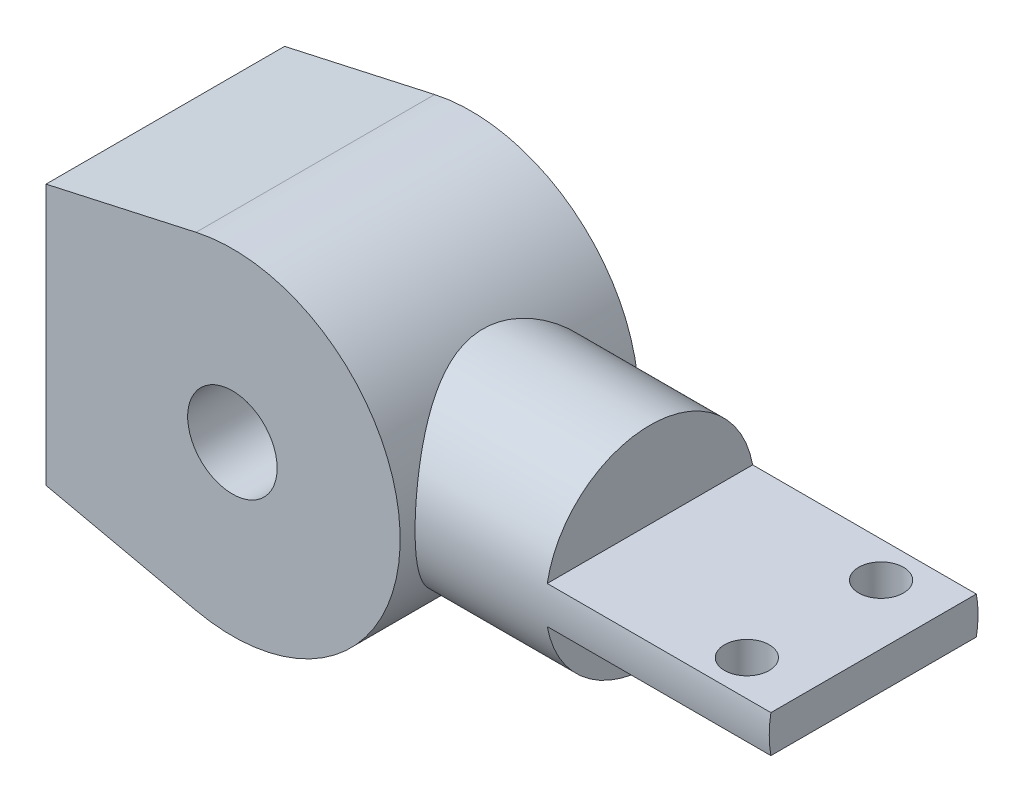
ISO-10303-21;
HEADER;
FILE_DESCRIPTION(('STEP AP214'),'2;1');
FILE_NAME('part.step','',(''),(''),'','','');
FILE_SCHEMA(('AUTOMOTIVE_DESIGN { 1 0 10303 214 1 1 1 1 }'));
ENDSEC;
DATA;
#1=APPLICATION_CONTEXT('core data for automotive mechanical design processes');
#2=APPLICATION_PROTOCOL_DEFINITION('international standard','automotive_design',2000,#1);
#3=PRODUCT_CONTEXT('',#1,'mechanical');
#4=PRODUCT('Part','Part','',(#3));
#5=PRODUCT_RELATED_PRODUCT_CATEGORY('part','',(#4));
#6=PRODUCT_DEFINITION_FORMATION('','',#4);
#7=PRODUCT_DEFINITION_CONTEXT('part definition',#1,'design');
#8=PRODUCT_DEFINITION('design','',#6,#7);
#9=PRODUCT_DEFINITION_SHAPE('','',#8);
#10=(LENGTH_UNIT() NAMED_UNIT(*) SI_UNIT(.MILLI.,.METRE.));
#11=(NAMED_UNIT(*) PLANE_ANGLE_UNIT() SI_UNIT($,.RADIAN.));
#12=(NAMED_UNIT(*) SI_UNIT($,.STERADIAN.) SOLID_ANGLE_UNIT());
#13=UNCERTAINTY_MEASURE_WITH_UNIT(LENGTH_MEASURE(1.E-05),#10,'distance_accuracy_value','');
#14=(GEOMETRIC_REPRESENTATION_CONTEXT(3) GLOBAL_UNCERTAINTY_ASSIGNED_CONTEXT((#13)) GLOBAL_UNIT_ASSIGNED_CONTEXT((#10,
#11,#12)) REPRESENTATION_CONTEXT('',''));
#15=CARTESIAN_POINT('',(0.,0.,0.));
#16=DIRECTION('',(0.,0.,1.));
#17=DIRECTION('',(1.,0.,0.));
#18=AXIS2_PLACEMENT_3D('',#15,#16,#17);
#19=CARTESIAN_POINT('',(40.,0.,0.));
#20=DIRECTION('',(1.,0.,0.));
#21=DIRECTION('',(0.,0.,-1.));
#22=AXIS2_PLACEMENT_3D('',#19,#20,#21);
#23=PLANE('',#22);
#24=CARTESIAN_POINT('',(40.,0.,0.));
#25=DIRECTION('',(1.,0.,0.));
#26=DIRECTION('',(0.,0.,-1.));
#27=AXIS2_PLACEMENT_3D('',#24,#25,#26);
#28=CIRCLE('',#27,14.);
#29=CARTESIAN_POINT('',(40.,2.5,-13.7749773139559));
#30=VERTEX_POINT('',#29);
#31=CARTESIAN_POINT('',(40.,2.5,13.7749773139559));
#32=VERTEX_POINT('',#31);
#33=EDGE_CURVE('E61',#30,#32,#28,.T.);
#34=ORIENTED_EDGE('',*,*,#33,.T.);
#35=DIRECTION('',(0.,0.,-1.));
#36=VECTOR('',#35,1.);
#37=CARTESIAN_POINT('',(40.,2.5,0.));
#38=LINE('',#37,#36);
#39=EDGE_CURVE('E111',#32,#30,#38,.T.);
#40=ORIENTED_EDGE('',*,*,#39,.T.);
#41=EDGE_LOOP('',(#34,#40));
#42=FACE_BOUND('',#41,.T.);
#43=ADVANCED_FACE('F38',(#42),#23,.T.);
#44=CARTESIAN_POINT('',(0.,0.,16.));
#45=DIRECTION('',(0.,0.,1.));
#46=DIRECTION('',(1.,0.,0.));
#47=AXIS2_PLACEMENT_3D('',#44,#45,#46);
#48=PLANE('',#47);
#49=DIRECTION('',(-0.976255788673511,-0.216620947928542,0.));
#50=VECTOR('',#49,1.);
#51=CARTESIAN_POINT('',(-4.87397132839219,21.965755245154,16.));
#52=LINE('',#51,#50);
#53=CARTESIAN_POINT('',(-4.87397132839219,21.965755245154,16.));
#54=VERTEX_POINT('',#53);
#55=CARTESIAN_POINT('',(-25.,17.5,16.));
#56=VERTEX_POINT('',#55);
#57=EDGE_CURVE('E201',#54,#56,#52,.T.);
#58=ORIENTED_EDGE('',*,*,#57,.T.);
#59=DIRECTION('',(0.,-1.,0.));
#60=VECTOR('',#59,1.);
#61=CARTESIAN_POINT('',(-25.,17.5,16.));
#62=LINE('',#61,#60);
#63=CARTESIAN_POINT('',(-25.,-17.5,16.));
#64=VERTEX_POINT('',#63);
#65=EDGE_CURVE('E213',#56,#64,#62,.T.);
#66=ORIENTED_EDGE('',*,*,#65,.T.);
#67=DIRECTION('',(0.976255788673511,-0.216620947928542,0.));
#68=VECTOR('',#67,1.);
#69=CARTESIAN_POINT('',(-4.87397132839219,-21.965755245154,16.));
#70=LINE('',#69,#68);
#71=CARTESIAN_POINT('',(-4.87397132839219,-21.965755245154,16.));
#72=VERTEX_POINT('',#71);
#73=EDGE_CURVE('E211',#64,#72,#70,.T.);
#74=ORIENTED_EDGE('',*,*,#73,.T.);
#75=CARTESIAN_POINT('',(0.,0.,16.));
#76=DIRECTION('',(0.,0.,1.));
#77=DIRECTION('',(1.,0.,0.));
#78=AXIS2_PLACEMENT_3D('',#75,#76,#77);
#79=CIRCLE('',#78,22.5);
#80=EDGE_CURVE('E198',#72,#54,#79,.T.);
#81=ORIENTED_EDGE('',*,*,#80,.T.);
#82=EDGE_LOOP('',(#58,#66,#74,#81));
#83=FACE_BOUND('',#82,.T.);
#84=CARTESIAN_POINT('',(0.,0.,16.));
#85=DIRECTION('',(0.,0.,1.));
#86=DIRECTION('',(1.,0.,0.));
#87=AXIS2_PLACEMENT_3D('',#84,#85,#86);
#88=CIRCLE('',#87,6.);
#89=CARTESIAN_POINT('',(6.,0.,16.));
#90=VERTEX_POINT('',#89);
#91=EDGE_CURVE('E209',#90,#90,#88,.T.);
#92=ORIENTED_EDGE('',*,*,#91,.F.);
#93=EDGE_LOOP('',(#92));
#94=FACE_BOUND('',#93,.T.);
#95=ADVANCED_FACE('F168',(#83,#94),#48,.T.);
#96=CARTESIAN_POINT('',(0.,0.,-16.));
#97=DIRECTION('',(0.,0.,1.));
#98=DIRECTION('',(1.,0.,0.));
#99=AXIS2_PLACEMENT_3D('',#96,#97,#98);
#100=PLANE('',#99);
#101=DIRECTION('',(-0.976255788673511,-0.216620947928542,0.));
#102=VECTOR('',#101,1.);
#103=CARTESIAN_POINT('',(-4.87397132839219,21.965755245154,-16.));
#104=LINE('',#103,#102);
#105=CARTESIAN_POINT('',(-4.87397132839219,21.965755245154,-16.));
#106=VERTEX_POINT('',#105);
#107=CARTESIAN_POINT('',(-25.,17.5,-16.));
#108=VERTEX_POINT('',#107);
#109=EDGE_CURVE('E206',#106,#108,#104,.T.);
#110=ORIENTED_EDGE('',*,*,#109,.F.);
#111=CARTESIAN_POINT('',(0.,0.,-16.));
#112=DIRECTION('',(0.,0.,1.));
#113=DIRECTION('',(1.,0.,0.));
#114=AXIS2_PLACEMENT_3D('',#111,#112,#113);
#115=CIRCLE('',#114,22.5);
#116=CARTESIAN_POINT('',(-4.87397132839219,-21.965755245154,-16.));
#117=VERTEX_POINT('',#116);
#118=EDGE_CURVE('E199',#117,#106,#115,.T.);
#119=ORIENTED_EDGE('',*,*,#118,.F.);
#120=DIRECTION('',(0.976255788673511,-0.216620947928542,0.));
#121=VECTOR('',#120,1.);
#122=CARTESIAN_POINT('',(-4.87397132839219,-21.965755245154,-16.));
#123=LINE('',#122,#121);
#124=CARTESIAN_POINT('',(-25.,-17.5,-16.));
#125=VERTEX_POINT('',#124);
#126=EDGE_CURVE('E202',#125,#117,#123,.T.);
#127=ORIENTED_EDGE('',*,*,#126,.F.);
#128=DIRECTION('',(0.,-1.,0.));
#129=VECTOR('',#128,1.);
#130=CARTESIAN_POINT('',(-25.,17.5,-16.));
#131=LINE('',#130,#129);
#132=EDGE_CURVE('E204',#108,#125,#131,.T.);
#133=ORIENTED_EDGE('',*,*,#132,.F.);
#134=EDGE_LOOP('',(#110,#119,#127,#133));
#135=FACE_BOUND('',#134,.T.);
#136=CARTESIAN_POINT('',(0.,0.,-16.));
#137=DIRECTION('',(0.,0.,1.));
#138=DIRECTION('',(1.,0.,0.));
#139=AXIS2_PLACEMENT_3D('',#136,#137,#138);
#140=CIRCLE('',#139,6.);
#141=CARTESIAN_POINT('',(6.,0.,-16.));
#142=VERTEX_POINT('',#141);
#143=EDGE_CURVE('E217',#142,#142,#140,.T.);
#144=ORIENTED_EDGE('',*,*,#143,.T.);
#145=EDGE_LOOP('',(#144));
#146=FACE_BOUND('',#145,.T.);
#147=ADVANCED_FACE('F224',(#135,#146),#100,.F.);
#148=CARTESIAN_POINT('',(-4.87397132839219,21.965755245154,16.));
#149=DIRECTION('',(0.216620947928542,-0.976255788673511,0.));
#150=DIRECTION('',(0.976255788673512,0.216620947928542,0.));
#151=AXIS2_PLACEMENT_3D('',#148,#149,#150);
#152=PLANE('',#151);
#153=ORIENTED_EDGE('',*,*,#109,.T.);
#154=DIRECTION('',(0.,0.,-1.));
#155=VECTOR('',#154,1.);
#156=CARTESIAN_POINT('',(-25.,17.5,16.));
#157=LINE('',#156,#155);
#158=EDGE_CURVE('E11',#56,#108,#157,.T.);
#159=ORIENTED_EDGE('',*,*,#158,.F.);
#160=ORIENTED_EDGE('',*,*,#57,.F.);
#161=DIRECTION('',(0.,0.,-1.));
#162=VECTOR('',#161,1.);
#163=CARTESIAN_POINT('',(-4.87397132839219,21.965755245154,16.));
#164=LINE('',#163,#162);
#165=EDGE_CURVE('E195',#54,#106,#164,.T.);
#166=ORIENTED_EDGE('',*,*,#165,.T.);
#167=EDGE_LOOP('',(#153,#159,#160,#166));
#168=FACE_BOUND('',#167,.T.);
#169=ADVANCED_FACE('F40',(#168),#152,.F.);
#170=CARTESIAN_POINT('',(-25.,17.5,16.));
#171=DIRECTION('',(1.,0.,0.));
#172=DIRECTION('',(0.,0.,-1.));
#173=AXIS2_PLACEMENT_3D('',#170,#171,#172);
#174=PLANE('',#173);
#175=ORIENTED_EDGE('',*,*,#132,.T.);
#176=DIRECTION('',(0.,0.,-1.));
#177=VECTOR('',#176,1.);
#178=CARTESIAN_POINT('',(-25.,-17.5,16.));
#179=LINE('',#178,#177);
#180=EDGE_CURVE('E47',#64,#125,#179,.T.);
#181=ORIENTED_EDGE('',*,*,#180,.F.);
#182=ORIENTED_EDGE('',*,*,#65,.F.);
#183=ORIENTED_EDGE('',*,*,#158,.T.);
#184=EDGE_LOOP('',(#175,#181,#182,#183));
#185=FACE_BOUND('',#184,.T.);
#186=ADVANCED_FACE('F238',(#185),#174,.F.);
#187=CARTESIAN_POINT('',(-4.87397132839219,-21.965755245154,16.));
#188=DIRECTION('',(0.216620947928542,0.976255788673511,0.));
#189=DIRECTION('',(-0.976255788673512,0.216620947928542,0.));
#190=AXIS2_PLACEMENT_3D('',#187,#188,#189);
#191=PLANE('',#190);
#192=ORIENTED_EDGE('',*,*,#126,.T.);
#193=DIRECTION('',(0.,0.,-1.));
#194=VECTOR('',#193,1.);
#195=CARTESIAN_POINT('',(-4.87397132839219,-21.965755245154,16.));
#196=LINE('',#195,#194);
#197=EDGE_CURVE('E192',#72,#117,#196,.T.);
#198=ORIENTED_EDGE('',*,*,#197,.F.);
#199=ORIENTED_EDGE('',*,*,#73,.F.);
#200=ORIENTED_EDGE('',*,*,#180,.T.);
#201=EDGE_LOOP('',(#192,#198,#199,#200));
#202=FACE_BOUND('',#201,.T.);
#203=ADVANCED_FACE('F235',(#202),#191,.F.);
#204=CARTESIAN_POINT('',(0.,0.,16.));
#205=DIRECTION('',(0.,0.,-1.));
#206=DIRECTION('',(-1.,0.,0.));
#207=AXIS2_PLACEMENT_3D('',#204,#205,#206);
#208=CYLINDRICAL_SURFACE('',#207,22.5);
#209=CARTESIAN_POINT('',(22.5,0.,-14.));
#210=CARTESIAN_POINT('',(22.4999990143699,0.356097070760692,-13.9999991063449));
#211=CARTESIAN_POINT('',(22.4915272958149,0.712218350277574,-13.9863954765435));
#212=CARTESIAN_POINT('',(22.4578466611244,1.42174063001493,-13.9321685824194));
#213=CARTESIAN_POINT('',(22.4326301887648,1.77514032923202,-13.8915331197188));
#214=CARTESIAN_POINT('',(22.3660283513862,2.47694073666972,-13.7837231030717));
#215=CARTESIAN_POINT('',(22.3246150990087,2.82533174256533,-13.7165027734724));
#216=CARTESIAN_POINT('',(22.2266321618331,3.51394010054276,-13.5564441244614));
#217=CARTESIAN_POINT('',(22.1700640019058,3.85415827121584,-13.4636083824175));
#218=CARTESIAN_POINT('',(22.0433958764243,4.52259338441289,-13.2539894629711));
#219=CARTESIAN_POINT('',(21.9733648543906,4.85086174847135,-13.1373281147551));
#220=CARTESIAN_POINT('',(21.8211053520407,5.49536361825577,-12.8810427155204));
#221=CARTESIAN_POINT('',(21.7388766091287,5.81159686470234,-12.7414181701369));
#222=CARTESIAN_POINT('',(21.5639238631528,6.43044019166893,-12.4405700102356));
#223=CARTESIAN_POINT('',(21.4712031207009,6.73305446393551,-12.2793531031596));
#224=CARTESIAN_POINT('',(21.2770168328875,7.32360555209682,-11.9365571460911));
#225=CARTESIAN_POINT('',(21.1755502028841,7.61154054043849,-11.7549755696832));
#226=CARTESIAN_POINT('',(20.9573974599138,8.19400545558421,-11.3574765199916));
#227=CARTESIAN_POINT('',(20.8401426208988,8.48724295592486,-11.1399774171205));
#228=CARTESIAN_POINT('',(20.600024873324,9.05449350465571,-10.6840341744649));
#229=CARTESIAN_POINT('',(20.4771617165154,9.32850570068461,-10.445589107087));
#230=CARTESIAN_POINT('',(20.2281690739126,9.85680235955471,-9.94862465188904));
#231=CARTESIAN_POINT('',(20.1020356451637,10.111061375416,-9.69008020116803));
#232=CARTESIAN_POINT('',(19.8492724340888,10.5986702200811,-9.1542032090265));
#233=CARTESIAN_POINT('',(19.722642637357,10.8320194372713,-8.87687011845291));
#234=CARTESIAN_POINT('',(19.4547996495074,11.3068419436011,-8.2658596247561));
#235=CARTESIAN_POINT('',(19.3139089577244,11.545205662179,-7.92961458355073));
#236=CARTESIAN_POINT('',(19.0393482416016,11.9925865501106,-7.23522428056693));
#237=CARTESIAN_POINT('',(18.9056795541224,12.2015982975125,-6.877074990088));
#238=CARTESIAN_POINT('',(18.6504569420656,12.5882506642244,-6.14073545483857));
#239=CARTESIAN_POINT('',(18.528886831374,12.7659334496767,-5.76257305179082));
#240=CARTESIAN_POINT('',(18.3026958276451,13.0881671689531,-4.98756561364782));
#241=CARTESIAN_POINT('',(18.1980680018518,13.2327316648236,-4.59072830652404));
#242=CARTESIAN_POINT('',(18.0349292211783,13.4538110619401,-3.88513918827319));
#243=CARTESIAN_POINT('',(17.9714792470539,13.5382643592609,-3.57999709901742));
#244=CARTESIAN_POINT('',(17.8586883245612,13.6867074831745,-2.96224320580907));
#245=CARTESIAN_POINT('',(17.8093439846518,13.7507022292345,-2.64963321704918));
#246=CARTESIAN_POINT('',(17.7265086605148,13.8573251676281,-2.01907360660311));
#247=CARTESIAN_POINT('',(17.6929994513684,13.8999779261594,-1.70113056156642));
#248=CARTESIAN_POINT('',(17.6430064881633,13.9633794501665,-1.06171502205683));
#249=CARTESIAN_POINT('',(17.6265229749471,13.9841279057882,-0.740242477721284));
#250=CARTESIAN_POINT('',(17.6112162512838,14.0034002854199,-0.0953808872242191));
#251=CARTESIAN_POINT('',(17.6124383808281,14.0018671514822,0.228010958708225));
#252=CARTESIAN_POINT('',(17.6326039054413,13.97646364726,0.873354428547934));
#253=CARTESIAN_POINT('',(17.6515473921147,13.9525931615104,1.19530604500179));
#254=CARTESIAN_POINT('',(17.7064243703099,13.8828847906998,1.83556301177622));
#255=CARTESIAN_POINT('',(17.7423695341295,13.8370318135284,2.15386570296615));
#256=CARTESIAN_POINT('',(17.8299101531281,13.7240443241488,2.78446216526763));
#257=CARTESIAN_POINT('',(17.8815059542076,13.6569093415775,3.09675580340859));
#258=CARTESIAN_POINT('',(17.9972888935506,13.5039464211317,3.70676991729286));
#259=CARTESIAN_POINT('',(18.0611741417939,13.4185620879421,4.00465984733719));
#260=CARTESIAN_POINT('',(18.2003635920619,13.2291560354186,4.59179982140109));
#261=CARTESIAN_POINT('',(18.2756715114669,13.1251282467728,4.88104701592401));
#262=CARTESIAN_POINT('',(18.4357306593898,12.8993400599701,5.44983142456797));
#263=CARTESIAN_POINT('',(18.5204822849188,12.7775789162412,5.7293682298181));
#264=CARTESIAN_POINT('',(18.6974771275311,12.517153681204,6.27798380238451));
#265=CARTESIAN_POINT('',(18.7897207095436,12.3784887663568,6.54706205932532));
#266=CARTESIAN_POINT('',(18.997481055651,12.0577227084505,7.12315036574905));
#267=CARTESIAN_POINT('',(19.114138485546,11.8723373870692,7.42792424344295));
#268=CARTESIAN_POINT('',(19.3523613239283,11.4799300062105,8.02107596986107));
#269=CARTESIAN_POINT('',(19.4739260475583,11.2729109595519,8.30945609304614));
#270=CARTESIAN_POINT('',(19.7193557781036,10.8378705685859,8.86940709190691));
#271=CARTESIAN_POINT('',(19.8432230246409,10.6098278185812,9.14096035407191));
#272=CARTESIAN_POINT('',(20.0905456910712,10.1337040929321,9.6661096951861));
#273=CARTESIAN_POINT('',(20.2140010842358,9.88562184213812,9.9197046294846));
#274=CARTESIAN_POINT('',(20.4778479284996,9.3283197696847,10.4476162402387));
#275=CARTESIAN_POINT('',(20.6177380925806,9.01571048102724,10.7186212696107));
#276=CARTESIAN_POINT('',(20.8899601598757,8.36562967979878,11.2333493529561));
#277=CARTESIAN_POINT('',(21.0222911743807,8.02815525453593,11.4770692023033));
#278=CARTESIAN_POINT('',(21.2758074096154,7.3299323932841,11.9350888320568));
#279=CARTESIAN_POINT('',(21.3969953836647,6.96918974429674,12.1493958865148));
#280=CARTESIAN_POINT('',(21.6248469618756,6.22630498724363,12.5463308451294));
#281=CARTESIAN_POINT('',(21.7315123020849,5.84416544470126,12.7289625365012));
#282=CARTESIAN_POINT('',(21.9217363589385,5.08260793859718,13.0509942907445));
#283=CARTESIAN_POINT('',(22.0062449689521,4.70420212464339,13.1922230753291));
#284=CARTESIAN_POINT('',(22.1570252528652,3.93324908027808,13.442236496525));
#285=CARTESIAN_POINT('',(22.2232972892521,3.54070213112461,13.5510217780177));
#286=CARTESIAN_POINT('',(22.3354988912287,2.74528889528994,13.7342547837559));
#287=CARTESIAN_POINT('',(22.3814519255366,2.34243508535216,13.8087421267131));
#288=CARTESIAN_POINT('',(22.4516271114232,1.52990582154782,13.9221968391314));
#289=CARTESIAN_POINT('',(22.4758528968536,1.12023152007733,13.961170148282));
#290=CARTESIAN_POINT('',(22.4998719272296,0.358889373676654,13.9997998195308));
#291=CARTESIAN_POINT('',(22.5027361711104,0.00755774378719221,14.0043982827077));
#292=CARTESIAN_POINT('',(22.4920251896601,-0.694179982355568,13.9871816996814));
#293=CARTESIAN_POINT('',(22.4784519037889,-1.04458618291156,13.9653697696335));
#294=CARTESIAN_POINT('',(22.4352021344506,-1.74175208722438,13.8956481416465));
#295=CARTESIAN_POINT('',(22.4055265956152,-2.08851200367258,13.8477399746312));
#296=CARTESIAN_POINT('',(22.3307880770863,-2.77586354777609,13.7264844114638));
#297=CARTESIAN_POINT('',(22.285724811575,-3.11645506073326,13.653136542784));
#298=CARTESIAN_POINT('',(22.1832184234865,-3.77653035917098,13.4851559526508));
#299=CARTESIAN_POINT('',(22.1263027830684,-4.09632676495062,13.3914243330754));
#300=CARTESIAN_POINT('',(22.0003545406357,-4.72626431908141,13.1822823440839));
#301=CARTESIAN_POINT('',(21.931322429587,-5.0364058580537,13.0668728530538));
#302=CARTESIAN_POINT('',(21.782472736762,-5.64554678099418,12.8154741779394));
#303=CARTESIAN_POINT('',(21.7026548278234,-5.94454582662948,12.6794843695837));
#304=CARTESIAN_POINT('',(21.5336854587996,-6.5301837746921,12.3880468486983));
#305=CARTESIAN_POINT('',(21.4445328551239,-6.81682115660849,12.2325967516374));
#306=CARTESIAN_POINT('',(21.2490077061142,-7.40508045510371,11.8866610539475));
#307=CARTESIAN_POINT('',(21.1418056549229,-7.70527800990255,11.6942214627053));
#308=CARTESIAN_POINT('',(20.9200990227065,-8.28835118714579,11.288463870177));
#309=CARTESIAN_POINT('',(20.8055940342632,-8.57122584144697,11.0751447036999));
#310=CARTESIAN_POINT('',(20.5713838782847,-9.11904546917578,10.628640705419));
#311=CARTESIAN_POINT('',(20.4516736642968,-9.38397237592854,10.3954363746239));
#312=CARTESIAN_POINT('',(20.2094563165926,-9.89483745973913,9.91041232281628));
#313=CARTESIAN_POINT('',(20.0869489675645,-10.1407741685819,9.65859116539602));
#314=CARTESIAN_POINT('',(19.8238941960109,-10.646867649964,9.09978037256264));
#315=CARTESIAN_POINT('',(19.6832841834239,-10.9039892311197,8.79006308548143));
#316=CARTESIAN_POINT('',(19.4053328807151,-11.3913021109329,8.14864949782422));
#317=CARTESIAN_POINT('',(19.2679921450446,-11.621488867149,7.81694950469237));
#318=CARTESIAN_POINT('',(19.0008081273582,-12.0533696487139,7.13300281471241));
#319=CARTESIAN_POINT('',(18.8709590653482,-12.25508581837,6.78077239104192));
#320=CARTESIAN_POINT('',(18.623036461906,-12.6286498218822,6.05666117524255));
#321=CARTESIAN_POINT('',(18.5049651721,-12.8004919491879,5.68477664643217));
#322=CARTESIAN_POINT('',(18.308524713068,-13.0793953783023,5.0034855779446));
#323=CARTESIAN_POINT('',(18.2270330766376,-13.1924763545354,4.69743443018148));
#324=CARTESIAN_POINT('',(18.076746941565,-13.3976638555018,4.07550371447287));
#325=CARTESIAN_POINT('',(18.0079448101369,-13.489782996707,3.75963018923896));
#326=CARTESIAN_POINT('',(17.8853144274028,-13.6519549960383,3.11976359885008));
#327=CARTESIAN_POINT('',(17.8314700867102,-13.7220315751265,2.79577966995472));
#328=CARTESIAN_POINT('',(17.7406403655119,-13.8392629880396,2.14132899837133));
#329=CARTESIAN_POINT('',(17.7036549489399,-13.8864178709009,1.8108622695535));
#330=CARTESIAN_POINT('',(17.6478825891211,-13.9572312071607,1.14399970642003));
#331=CARTESIAN_POINT('',(17.6291980840485,-13.9807574190091,0.807581108722389));
#332=CARTESIAN_POINT('',(17.6111969753959,-14.0034266162649,0.133399167373299));
#333=CARTESIAN_POINT('',(17.6118803050355,-14.0025696857454,-0.204364171637467));
#334=CARTESIAN_POINT('',(17.6325872637024,-13.9764850836819,-0.878453554406331));
#335=CARTESIAN_POINT('',(17.6526172788984,-13.9512493649163,-1.21477908673595));
#336=CARTESIAN_POINT('',(17.7111635018145,-13.8768481077348,-1.88312198541007));
#337=CARTESIAN_POINT('',(17.749679494092,-13.8276828482026,-2.21513940191667));
#338=CARTESIAN_POINT('',(17.840004620949,-13.7109159899639,-2.84709643093499));
#339=CARTESIAN_POINT('',(17.8905606177838,-13.6450271196387,-3.14753630822844));
#340=CARTESIAN_POINT('',(18.0044960451393,-13.4943337274358,-3.74122938906233));
#341=CARTESIAN_POINT('',(18.0678795853599,-13.4095231425079,-4.03448025553805));
#342=CARTESIAN_POINT('',(18.2056705838513,-13.221841038016,-4.61251008112275));
#343=CARTESIAN_POINT('',(18.2800790946627,-13.1189677938579,-4.89728822823095));
#344=CARTESIAN_POINT('',(18.4380147760727,-12.8960582969548,-5.45734443068171));
#345=CARTESIAN_POINT('',(18.5215422903159,-12.7760213973541,-5.73262212749024));
#346=CARTESIAN_POINT('',(18.8085087023368,-12.3537800104942,-6.62221127308822));
#347=CARTESIAN_POINT('',(19.0275484110721,-12.0164484645334,-7.21544987836899));
#348=CARTESIAN_POINT('',(19.3687576085944,-11.4520694849974,-8.06010022417248));
#349=CARTESIAN_POINT('',(19.4846859677146,-11.2540573187376,-8.33428789874449));
#350=CARTESIAN_POINT('',(19.7185274416532,-10.8391103665342,-8.86722196562069));
#351=CARTESIAN_POINT('',(19.8364406997267,-10.6221742100325,-9.12596723722914));
#352=CARTESIAN_POINT('',(20.0948793656167,-10.1261301722912,-9.67595262090818));
#353=CARTESIAN_POINT('',(20.2353422163846,-9.8431365748014,-9.96372478000989));
#354=CARTESIAN_POINT('',(20.5122398874249,-9.25227001166964,-10.514689399335));
#355=CARTESIAN_POINT('',(20.6486741855883,-8.94439384034817,-10.777878683044));
#356=CARTESIAN_POINT('',(20.9141680993678,-8.30466819647365,-11.278183042151));
#357=CARTESIAN_POINT('',(21.0432226332422,-7.97280255237931,-11.5152802518571));
#358=CARTESIAN_POINT('',(21.2286445071225,-7.45841218343328,-11.8496380531149));
#359=CARTESIAN_POINT('',(21.2890912173789,-7.28418533088142,-11.9575416277361));
#360=CARTESIAN_POINT('',(21.4069042672453,-6.93031323868879,-12.1660574077229));
#361=CARTESIAN_POINT('',(21.4642694527674,-6.75066600781436,-12.2666668861796));
#362=CARTESIAN_POINT('',(21.6308630806129,-6.20485018192081,-12.5566431024792));
#363=CARTESIAN_POINT('',(21.734893555375,-5.83097261813778,-12.7347014185717));
#364=CARTESIAN_POINT('',(21.9259968322529,-5.06520334425361,-13.0581919714671));
#365=CARTESIAN_POINT('',(22.0130726600171,-4.67331486375517,-13.2036300302365));
#366=CARTESIAN_POINT('',(22.1288541727767,-4.07492554203533,-13.3954748988431));
#367=CARTESIAN_POINT('',(22.1649399126865,-3.87396203641954,-13.4549795158029));
#368=CARTESIAN_POINT('',(22.2319460011667,-3.46882497824043,-13.5650774576718));
#369=CARTESIAN_POINT('',(22.2628676920629,-3.26465227501013,-13.6156730985371));
#370=CARTESIAN_POINT('',(22.3474561898602,-2.64818147624365,-13.7536968188771));
#371=CARTESIAN_POINT('',(22.3930199664094,-2.23155423681449,-13.8274827573131));
#372=CARTESIAN_POINT('',(22.4511563186984,-1.51200587963174,-13.9213973375204));
#373=CARTESIAN_POINT('',(22.4694403922936,-1.21069651376639,-13.9508414460303));
#374=CARTESIAN_POINT('',(22.493863027433,-0.60626402043172,-13.9901437623131));
#375=CARTESIAN_POINT('',(22.500000839054,-0.303140782130808,-14.0000007607569));
#376=CARTESIAN_POINT('',(22.5,0.,-14.));
#377=B_SPLINE_CURVE_WITH_KNOTS('',3,(#209,#210,#211,#212,#213,#214,#215,#216,#217,#218,#219,
#220,#221,#222,#223,#224,#225,#226,#227,#228,#229,#230,#231,#232,#233,#234,#235,#236,#237,#238,
#239,#240,#241,#242,#243,#244,#245,#246,#247,#248,#249,#250,#251,#252,#253,#254,#255,#256,#257,
#258,#259,#260,#261,#262,#263,#264,#265,#266,#267,#268,#269,#270,#271,#272,#273,#274,#275,#276,
#277,#278,#279,#280,#281,#282,#283,#284,#285,#286,#287,#288,#289,#290,#291,#292,#293,#294,#295,
#296,#297,#298,#299,#300,#301,#302,#303,#304,#305,#306,#307,#308,#309,#310,#311,#312,#313,#314,
#315,#316,#317,#318,#319,#320,#321,#322,#323,#324,#325,#326,#327,#328,#329,#330,#331,#332,#333,
#334,#335,#336,#337,#338,#339,#340,#341,#342,#343,#344,#345,#346,#347,#348,#349,#350,#351,#352,
#353,#354,#355,#356,#357,#358,#359,#360,#361,#362,#363,#364,#365,#366,#367,#368,#369,#370,#371,
#372,#373,#374,#375,#376),.UNSPECIFIED.,.T.,.F.,(4,2,2,2,2,2,2,2,2,2,2,2,2,2,2,2,2,2,2,2,2,2,2,
2,2,2,2,2,2,2,2,2,2,2,2,2,2,2,2,2,2,2,2,2,2,2,2,2,2,2,2,2,2,2,2,2,2,2,2,2,2,2,2,2,2,2,2,2,2,2,2,
2,2,2,2,2,2,2,2,2,2,2,2,4),(0.,1.0679758240011,2.13643390971612,3.20673980634869,
4.27693805034709,5.34179515043565,6.40667517837593,7.47122517637423,8.53590738751166,
9.68514764063391,10.8344388136121,11.9851868179432,13.1359684707804,14.4411277016062,
15.7465277076779,17.050157116286,18.3532517263712,19.3210355800973,20.2885865449823,
21.2550212106111,22.2214695470601,23.1903931671192,24.1593217957176,25.1289165983471,
26.0985328319181,27.0468234955661,27.9954234345664,28.9440632675324,29.8927493359957,
31.0176229184045,32.1423400536389,33.2682152625584,34.3941621694695,35.7027545883913,
37.0115005397421,38.319922240839,39.6281873945368,40.8643030963197,42.1003942261178,
43.3350539008242,44.5695070419136,45.6222879649376,46.6749446827224,47.7275396535305,
48.7801541767215,49.7933045186598,50.8064138166712,51.8195538519125,52.8328181521628,
53.9487475505037,55.0647392591575,56.1818381561973,57.299023334728,58.576749957317,
59.8546917533393,61.1316340282376,62.4088199577247,63.4167689572915,64.4241096801529,
65.4303626213413,66.4366134098462,67.4484649713284,68.4603130439499,69.4724952328049,
70.4846656255925,71.4188354910979,72.3533051219357,73.2878640230142,74.222458154589,
76.3635260888551,77.4355285185538,78.5076086519192,79.7882052430145,81.0689670801281,
82.3506004909615,82.9914037086745,83.6324452693032,84.9114151721034,86.1901566261962,
86.8279270975521,87.465531530065,88.7395392601873,89.648636993739,90.55779085421),.UNSPECIFIED.);
#378=CARTESIAN_POINT('',(22.5,0.,-14.));
#379=VERTEX_POINT('',#378);
#380=EDGE_CURVE('E113',#379,#379,#377,.T.);
#381=ORIENTED_EDGE('',*,*,#380,.F.);
#382=EDGE_LOOP('',(#381));
#383=FACE_BOUND('',#382,.T.);
#384=ORIENTED_EDGE('',*,*,#118,.T.);
#385=ORIENTED_EDGE('',*,*,#165,.F.);
#386=ORIENTED_EDGE('',*,*,#80,.F.);
#387=ORIENTED_EDGE('',*,*,#197,.T.);
#388=EDGE_LOOP('',(#384,#385,#386,#387));
#389=FACE_BOUND('',#388,.T.);
#390=ADVANCED_FACE('F165',(#383,#389),#208,.T.);
#391=CARTESIAN_POINT('',(0.,0.,16.));
#392=DIRECTION('',(0.,0.,-1.));
#393=DIRECTION('',(-1.,0.,0.));
#394=AXIS2_PLACEMENT_3D('',#391,#392,#393);
#395=CYLINDRICAL_SURFACE('',#394,6.);
#396=ORIENTED_EDGE('',*,*,#91,.T.);
#397=EDGE_LOOP('',(#396));
#398=FACE_BOUND('',#397,.T.);
#399=ORIENTED_EDGE('',*,*,#143,.F.);
#400=EDGE_LOOP('',(#399));
#401=FACE_BOUND('',#400,.T.);
#402=ADVANCED_FACE('F160',(#398,#401),#395,.F.);
#403=DIRECTION('',(0.,0.,-1.));
#404=VECTOR('',#403,1.);
#405=CARTESIAN_POINT('',(40.,-2.5,0.));
#406=LINE('',#405,#404);
#407=CARTESIAN_POINT('',(40.,-2.5,13.7749773139559));
#408=VERTEX_POINT('',#407);
#409=CARTESIAN_POINT('',(40.,-2.5,-13.7749773139559));
#410=VERTEX_POINT('',#409);
#411=EDGE_CURVE('E54',#408,#410,#406,.T.);
#412=ORIENTED_EDGE('',*,*,#411,.F.);
#413=EDGE_CURVE('E150',#408,#410,#28,.T.);
#414=ORIENTED_EDGE('',*,*,#413,.T.);
#415=EDGE_LOOP('',(#412,#414));
#416=FACE_BOUND('',#415,.T.);
#417=ADVANCED_FACE('F158',(#416),#23,.T.);
#418=CARTESIAN_POINT('',(-25.002,0.,0.));
#419=DIRECTION('',(1.,0.,0.));
#420=DIRECTION('',(0.,0.,-1.));
#421=AXIS2_PLACEMENT_3D('',#418,#419,#420);
#422=CYLINDRICAL_SURFACE('',#421,14.);
#423=ORIENTED_EDGE('',*,*,#33,.F.);
#424=DIRECTION('',(-1.,0.,0.));
#425=VECTOR('',#424,1.);
#426=CARTESIAN_POINT('',(70.,2.5,-13.7749773139559));
#427=LINE('',#426,#425);
#428=CARTESIAN_POINT('',(70.,2.5,-13.7749773139559));
#429=VERTEX_POINT('',#428);
#430=EDGE_CURVE('E137',#429,#30,#427,.T.);
#431=ORIENTED_EDGE('',*,*,#430,.F.);
#432=CARTESIAN_POINT('',(70.,0.,0.));
#433=DIRECTION('',(1.,0.,0.));
#434=DIRECTION('',(0.,0.,-1.));
#435=AXIS2_PLACEMENT_3D('',#432,#433,#434);
#436=CIRCLE('',#435,14.);
#437=CARTESIAN_POINT('',(70.,-2.5,-13.7749773139559));
#438=VERTEX_POINT('',#437);
#439=EDGE_CURVE('E125',#438,#429,#436,.T.);
#440=ORIENTED_EDGE('',*,*,#439,.F.);
#441=DIRECTION('',(-1.,0.,0.));
#442=VECTOR('',#441,1.);
#443=CARTESIAN_POINT('',(70.,-2.5,-13.7749773139559));
#444=LINE('',#443,#442);
#445=EDGE_CURVE('E139',#438,#410,#444,.T.);
#446=ORIENTED_EDGE('',*,*,#445,.T.);
#447=ORIENTED_EDGE('',*,*,#413,.F.);
#448=DIRECTION('',(-1.,0.,0.));
#449=VECTOR('',#448,1.);
#450=CARTESIAN_POINT('',(70.,-2.5,13.7749773139559));
#451=LINE('',#450,#449);
#452=CARTESIAN_POINT('',(70.,-2.5,13.7749773139559));
#453=VERTEX_POINT('',#452);
#454=EDGE_CURVE('E114',#453,#408,#451,.T.);
#455=ORIENTED_EDGE('',*,*,#454,.F.);
#456=CARTESIAN_POINT('',(70.,2.5,13.7749773139559));
#457=VERTEX_POINT('',#456);
#458=EDGE_CURVE('E117',#457,#453,#436,.T.);
#459=ORIENTED_EDGE('',*,*,#458,.F.);
#460=DIRECTION('',(-1.,0.,0.));
#461=VECTOR('',#460,1.);
#462=CARTESIAN_POINT('',(70.,2.5,13.7749773139559));
#463=LINE('',#462,#461);
#464=EDGE_CURVE('E105',#457,#32,#463,.T.);
#465=ORIENTED_EDGE('',*,*,#464,.T.);
#466=EDGE_LOOP('',(#423,#431,#440,#446,#447,#455,#459,#465));
#467=FACE_BOUND('',#466,.T.);
#468=ORIENTED_EDGE('',*,*,#380,.T.);
#469=EDGE_LOOP('',(#468));
#470=FACE_BOUND('',#469,.T.);
#471=ADVANCED_FACE('F118',(#467,#470),#422,.T.);
#472=CARTESIAN_POINT('',(70.,2.5,0.));
#473=DIRECTION('',(0.,1.,0.));
#474=DIRECTION('',(0.,0.,1.));
#475=AXIS2_PLACEMENT_3D('',#472,#473,#474);
#476=PLANE('',#475);
#477=CARTESIAN_POINT('',(62.,2.5,9.));
#478=DIRECTION('',(0.,1.,0.));
#479=DIRECTION('',(0.,0.,1.));
#480=AXIS2_PLACEMENT_3D('',#477,#478,#479);
#481=CIRCLE('',#480,3.00000000000001);
#482=CARTESIAN_POINT('',(62.,2.5,12.));
#483=VERTEX_POINT('',#482);
#484=EDGE_CURVE('E179',#483,#483,#481,.T.);
#485=ORIENTED_EDGE('',*,*,#484,.F.);
#486=EDGE_LOOP('',(#485));
#487=FACE_BOUND('',#486,.T.);
#488=CARTESIAN_POINT('',(62.,2.5,-9.));
#489=DIRECTION('',(0.,1.,0.));
#490=DIRECTION('',(0.,0.,-1.));
#491=AXIS2_PLACEMENT_3D('',#488,#489,#490);
#492=CIRCLE('',#491,2.99999999999999);
#493=CARTESIAN_POINT('',(62.,2.5,-12.));
#494=VERTEX_POINT('',#493);
#495=EDGE_CURVE('E132',#494,#494,#492,.T.);
#496=ORIENTED_EDGE('',*,*,#495,.F.);
#497=EDGE_LOOP('',(#496));
#498=FACE_BOUND('',#497,.T.);
#499=ORIENTED_EDGE('',*,*,#39,.F.);
#500=ORIENTED_EDGE('',*,*,#464,.F.);
#501=DIRECTION('',(0.,0.,-1.));
#502=VECTOR('',#501,1.);
#503=CARTESIAN_POINT('',(70.,2.5,0.));
#504=LINE('',#503,#502);
#505=EDGE_CURVE('E110',#457,#429,#504,.T.);
#506=ORIENTED_EDGE('',*,*,#505,.T.);
#507=ORIENTED_EDGE('',*,*,#430,.T.);
#508=EDGE_LOOP('',(#499,#500,#506,#507));
#509=FACE_BOUND('',#508,.T.);
#510=ADVANCED_FACE('F107',(#487,#498,#509),#476,.T.);
#511=CARTESIAN_POINT('',(70.,-2.5,0.));
#512=DIRECTION('',(0.,1.,0.));
#513=DIRECTION('',(0.,0.,1.));
#514=AXIS2_PLACEMENT_3D('',#511,#512,#513);
#515=PLANE('',#514);
#516=CARTESIAN_POINT('',(62.,-2.5,9.));
#517=DIRECTION('',(0.,1.,0.));
#518=DIRECTION('',(0.,0.,1.));
#519=AXIS2_PLACEMENT_3D('',#516,#517,#518);
#520=CIRCLE('',#519,3.00000000000001);
#521=CARTESIAN_POINT('',(62.,-2.5,12.));
#522=VERTEX_POINT('',#521);
#523=EDGE_CURVE('E42',#522,#522,#520,.T.);
#524=ORIENTED_EDGE('',*,*,#523,.T.);
#525=EDGE_LOOP('',(#524));
#526=FACE_BOUND('',#525,.T.);
#527=CARTESIAN_POINT('',(62.,-2.5,-9.));
#528=DIRECTION('',(0.,1.,0.));
#529=DIRECTION('',(0.,0.,1.));
#530=AXIS2_PLACEMENT_3D('',#527,#528,#529);
#531=CIRCLE('',#530,2.99999999999999);
#532=CARTESIAN_POINT('',(62.,-2.5,-6.00000000000001));
#533=VERTEX_POINT('',#532);
#534=EDGE_CURVE('E183',#533,#533,#531,.T.);
#535=ORIENTED_EDGE('',*,*,#534,.T.);
#536=EDGE_LOOP('',(#535));
#537=FACE_BOUND('',#536,.T.);
#538=ORIENTED_EDGE('',*,*,#411,.T.);
#539=ORIENTED_EDGE('',*,*,#445,.F.);
#540=DIRECTION('',(0.,0.,-1.));
#541=VECTOR('',#540,1.);
#542=CARTESIAN_POINT('',(70.,-2.5,0.));
#543=LINE('',#542,#541);
#544=EDGE_CURVE('E123',#453,#438,#543,.T.);
#545=ORIENTED_EDGE('',*,*,#544,.F.);
#546=ORIENTED_EDGE('',*,*,#454,.T.);
#547=EDGE_LOOP('',(#538,#539,#545,#546));
#548=FACE_BOUND('',#547,.T.);
#549=ADVANCED_FACE('F170',(#526,#537,#548),#515,.F.);
#550=CARTESIAN_POINT('',(70.,0.,0.));
#551=DIRECTION('',(1.,0.,0.));
#552=DIRECTION('',(0.,0.,-1.));
#553=AXIS2_PLACEMENT_3D('',#550,#551,#552);
#554=PLANE('',#553);
#555=ORIENTED_EDGE('',*,*,#505,.F.);
#556=ORIENTED_EDGE('',*,*,#458,.T.);
#557=ORIENTED_EDGE('',*,*,#544,.T.);
#558=ORIENTED_EDGE('',*,*,#439,.T.);
#559=EDGE_LOOP('',(#555,#556,#557,#558));
#560=FACE_BOUND('',#559,.T.);
#561=ADVANCED_FACE('F126',(#560),#554,.T.);
#562=CARTESIAN_POINT('',(62.,-27.5,-9.));
#563=DIRECTION('',(0.,1.,0.));
#564=DIRECTION('',(0.,0.,1.));
#565=AXIS2_PLACEMENT_3D('',#562,#563,#564);
#566=CYLINDRICAL_SURFACE('',#565,2.99999999999999);
#567=ORIENTED_EDGE('',*,*,#495,.T.);
#568=EDGE_LOOP('',(#567));
#569=FACE_BOUND('',#568,.T.);
#570=ORIENTED_EDGE('',*,*,#534,.F.);
#571=EDGE_LOOP('',(#570));
#572=FACE_BOUND('',#571,.T.);
#573=ADVANCED_FACE('F331',(#569,#572),#566,.F.);
#574=CARTESIAN_POINT('',(62.,-27.5,9.));
#575=DIRECTION('',(0.,1.,0.));
#576=DIRECTION('',(0.,0.,1.));
#577=AXIS2_PLACEMENT_3D('',#574,#575,#576);
#578=CYLINDRICAL_SURFACE('',#577,3.00000000000001);
#579=ORIENTED_EDGE('',*,*,#484,.T.);
#580=EDGE_LOOP('',(#579));
#581=FACE_BOUND('',#580,.T.);
#582=ORIENTED_EDGE('',*,*,#523,.F.);
#583=EDGE_LOOP('',(#582));
#584=FACE_BOUND('',#583,.T.);
#585=ADVANCED_FACE('F338',(#581,#584),#578,.F.);
#586=CLOSED_SHELL('',(#43,#95,#147,#169,#186,#203,#390,#402,#417,#471,#510,#549,#561,#573,#585));
#587=MANIFOLD_SOLID_BREP('B2',#586);
#588=ADVANCED_BREP_SHAPE_REPRESENTATION('',(#18,#587),#14);
#589=SHAPE_DEFINITION_REPRESENTATION(#9,#588);
ENDSEC;
END-ISO-10303-21;
